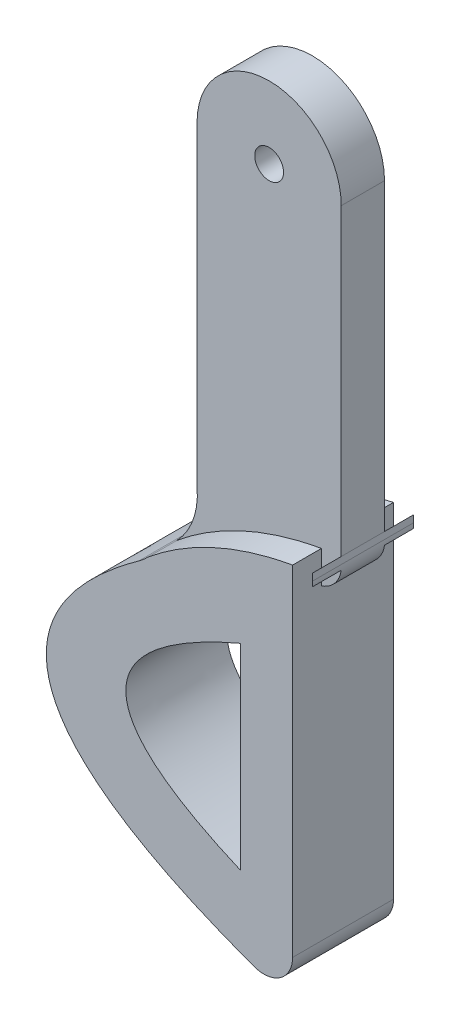
ISO-10303-21;
HEADER;
FILE_DESCRIPTION(('STEP AP214'),'2;1');
FILE_NAME('part.step','',(''),(''),'','','');
FILE_SCHEMA(('AUTOMOTIVE_DESIGN { 1 0 10303 214 1 1 1 1 }'));
ENDSEC;
DATA;
#1=APPLICATION_CONTEXT('core data for automotive mechanical design processes');
#2=APPLICATION_PROTOCOL_DEFINITION('international standard','automotive_design',2000,#1);
#3=PRODUCT_CONTEXT('',#1,'mechanical');
#4=PRODUCT('Part','Part','',(#3));
#5=PRODUCT_RELATED_PRODUCT_CATEGORY('part','',(#4));
#6=PRODUCT_DEFINITION_FORMATION('','',#4);
#7=PRODUCT_DEFINITION_CONTEXT('part definition',#1,'design');
#8=PRODUCT_DEFINITION('design','',#6,#7);
#9=PRODUCT_DEFINITION_SHAPE('','',#8);
#10=(LENGTH_UNIT() NAMED_UNIT(*) SI_UNIT(.MILLI.,.METRE.));
#11=(NAMED_UNIT(*) PLANE_ANGLE_UNIT() SI_UNIT($,.RADIAN.));
#12=(NAMED_UNIT(*) SI_UNIT($,.STERADIAN.) SOLID_ANGLE_UNIT());
#13=UNCERTAINTY_MEASURE_WITH_UNIT(LENGTH_MEASURE(1.E-05),#10,'distance_accuracy_value','');
#14=(GEOMETRIC_REPRESENTATION_CONTEXT(3) GLOBAL_UNCERTAINTY_ASSIGNED_CONTEXT((#13)) GLOBAL_UNIT_ASSIGNED_CONTEXT((#10,
#11,#12)) REPRESENTATION_CONTEXT('',''));
#15=CARTESIAN_POINT('',(0.,0.,0.));
#16=DIRECTION('',(0.,0.,1.));
#17=DIRECTION('',(1.,0.,0.));
#18=AXIS2_PLACEMENT_3D('',#15,#16,#17);
#19=CARTESIAN_POINT('',(-5.,0.,3.));
#20=DIRECTION('',(1.,0.,0.));
#21=DIRECTION('',(0.,0.,-1.));
#22=AXIS2_PLACEMENT_3D('',#19,#20,#21);
#23=PLANE('',#22);
#24=DIRECTION('',(0.,-1.,0.));
#25=VECTOR('',#24,1.);
#26=CARTESIAN_POINT('',(-5.,0.,0.));
#27=LINE('',#26,#25);
#28=CARTESIAN_POINT('',(-5.,0.,0.));
#29=VERTEX_POINT('',#28);
#30=CARTESIAN_POINT('',(-5.,-21.7449140027288,0.));
#31=VERTEX_POINT('',#30);
#32=EDGE_CURVE('E567',#29,#31,#27,.T.);
#33=ORIENTED_EDGE('',*,*,#32,.T.);
#34=DIRECTION('',(0.,0.,-1.));
#35=VECTOR('',#34,1.);
#36=CARTESIAN_POINT('',(-5.,-21.7449140027288,3.));
#37=LINE('',#36,#35);
#38=CARTESIAN_POINT('',(-5.,-21.7449140027288,3.));
#39=VERTEX_POINT('',#38);
#40=EDGE_CURVE('E345',#31,#39,#37,.F.);
#41=ORIENTED_EDGE('',*,*,#40,.T.);
#42=DIRECTION('',(0.,-1.,0.));
#43=VECTOR('',#42,1.);
#44=CARTESIAN_POINT('',(-5.,0.,3.));
#45=LINE('',#44,#43);
#46=CARTESIAN_POINT('',(-5.,0.,3.));
#47=VERTEX_POINT('',#46);
#48=EDGE_CURVE('E574',#47,#39,#45,.T.);
#49=ORIENTED_EDGE('',*,*,#48,.F.);
#50=DIRECTION('',(0.,0.,-1.));
#51=VECTOR('',#50,1.);
#52=CARTESIAN_POINT('',(-5.,0.,3.));
#53=LINE('',#52,#51);
#54=EDGE_CURVE('E555',#47,#29,#53,.T.);
#55=ORIENTED_EDGE('',*,*,#54,.T.);
#56=EDGE_LOOP('',(#33,#41,#49,#55));
#57=FACE_BOUND('',#56,.T.);
#58=ADVANCED_FACE('F39',(#57),#23,.F.);
#59=CARTESIAN_POINT('',(5.,-18.1113119604195,3.));
#60=DIRECTION('',(-1.,0.,0.));
#61=DIRECTION('',(0.,0.,1.));
#62=AXIS2_PLACEMENT_3D('',#59,#60,#61);
#63=PLANE('',#62);
#64=DIRECTION('',(0.,0.,-1.));
#65=VECTOR('',#64,1.);
#66=CARTESIAN_POINT('',(5.,-21.0685844003794,5.));
#67=LINE('',#66,#65);
#68=CARTESIAN_POINT('',(5.,-21.0685844003794,3.));
#69=VERTEX_POINT('',#68);
#70=CARTESIAN_POINT('',(5.,-21.0685844003794,0.));
#71=VERTEX_POINT('',#70);
#72=EDGE_CURVE('E410',#69,#71,#67,.T.);
#73=ORIENTED_EDGE('',*,*,#72,.T.);
#74=DIRECTION('',(0.,1.,0.));
#75=VECTOR('',#74,1.);
#76=CARTESIAN_POINT('',(5.,-18.1113119604195,0.));
#77=LINE('',#76,#75);
#78=CARTESIAN_POINT('',(5.,0.,0.));
#79=VERTEX_POINT('',#78);
#80=EDGE_CURVE('E564',#71,#79,#77,.T.);
#81=ORIENTED_EDGE('',*,*,#80,.T.);
#82=DIRECTION('',(0.,0.,-1.));
#83=VECTOR('',#82,1.);
#84=CARTESIAN_POINT('',(5.,0.,3.));
#85=LINE('',#84,#83);
#86=CARTESIAN_POINT('',(5.,0.,3.));
#87=VERTEX_POINT('',#86);
#88=EDGE_CURVE('E558',#87,#79,#85,.T.);
#89=ORIENTED_EDGE('',*,*,#88,.F.);
#90=DIRECTION('',(0.,1.,0.));
#91=VECTOR('',#90,1.);
#92=CARTESIAN_POINT('',(5.,-18.1113119604195,3.));
#93=LINE('',#92,#91);
#94=EDGE_CURVE('E563',#69,#87,#93,.T.);
#95=ORIENTED_EDGE('',*,*,#94,.F.);
#96=EDGE_LOOP('',(#73,#81,#89,#95));
#97=FACE_BOUND('',#96,.T.);
#98=ADVANCED_FACE('F308',(#97),#63,.F.);
#99=CARTESIAN_POINT('',(0.,0.,-2.));
#100=DIRECTION('',(0.,0.,1.));
#101=DIRECTION('',(1.,0.,0.));
#102=AXIS2_PLACEMENT_3D('',#99,#100,#101);
#103=PLANE('',#102);
#104=DIRECTION('',(0.,-1.,0.));
#105=VECTOR('',#104,1.);
#106=CARTESIAN_POINT('',(0.,0.,-2.));
#107=LINE('',#106,#105);
#108=CARTESIAN_POINT('',(0.,-27.7824292119615,-2.));
#109=VERTEX_POINT('',#108);
#110=CARTESIAN_POINT('',(0.,-41.4013766394128,-2.));
#111=VERTEX_POINT('',#110);
#112=EDGE_CURVE('E266',#109,#111,#107,.T.);
#113=ORIENTED_EDGE('',*,*,#112,.F.);
#114=CARTESIAN_POINT('',(0.,-41.4013766394128,-2.));
#115=CARTESIAN_POINT('',(-15.8731180361329,-34.5919029256872,-2.));
#116=CARTESIAN_POINT('',(0.,-27.7824292119615,-2.));
#117=B_SPLINE_CURVE_WITH_KNOTS('',2,(#114,#115,#116),.UNSPECIFIED.,.F.,.F.,(3,3),(0.,1.),.UNSPECIFIED.);
#118=EDGE_CURVE('E269',#111,#109,#117,.T.);
#119=ORIENTED_EDGE('',*,*,#118,.F.);
#120=EDGE_LOOP('',(#113,#119));
#121=FACE_BOUND('',#120,.T.);
#122=CARTESIAN_POINT('',(-9.97728763709814,-22.3083474319797,-2.));
#123=DIRECTION('',(0.,0.,1.));
#124=DIRECTION('',(1.,0.,0.));
#125=AXIS2_PLACEMENT_3D('',#122,#123,#124);
#126=CIRCLE('',#125,5.);
#127=CARTESIAN_POINT('',(-7.05337608426651,-26.3642987668971,-2.));
#128=VERTEX_POINT('',#127);
#129=CARTESIAN_POINT('',(-6.39993331971314,-25.8015602923544,-2.));
#130=VERTEX_POINT('',#129);
#131=EDGE_CURVE('E358',#128,#130,#126,.T.);
#132=ORIENTED_EDGE('',*,*,#131,.T.);
#133=CARTESIAN_POINT('',(3.62698575848767,-21.0043409745113,-2.));
#134=CARTESIAN_POINT('',(-2.57759639123351,-22.3609263451177,-2.));
#135=CARTESIAN_POINT('',(-7.05337608426651,-26.3642987668971,-2.));
#136=B_SPLINE_CURVE_WITH_KNOTS('',2,(#133,#134,#135),.UNSPECIFIED.,.F.,.F.,(3,3),(0.,1.),.UNSPECIFIED.);
#137=CARTESIAN_POINT('',(3.62698575848767,-21.0043409745113,-2.));
#138=VERTEX_POINT('',#137);
#139=EDGE_CURVE('E197',#138,#130,#136,.T.);
#140=ORIENTED_EDGE('',*,*,#139,.F.);
#141=DIRECTION('',(0.,-1.,0.));
#142=VECTOR('',#141,1.);
#143=CARTESIAN_POINT('',(3.62698575848767,0.,-2.));
#144=LINE('',#143,#142);
#145=CARTESIAN_POINT('',(3.62698575848767,-44.8321036066222,-2.));
#146=VERTEX_POINT('',#145);
#147=EDGE_CURVE('E186',#138,#146,#144,.T.);
#148=ORIENTED_EDGE('',*,*,#147,.T.);
#149=CARTESIAN_POINT('',(1.62698575848768,-44.8321036066222,-2.));
#150=DIRECTION('',(0.,0.,1.));
#151=DIRECTION('',(1.,0.,0.));
#152=AXIS2_PLACEMENT_3D('',#149,#150,#151);
#153=CIRCLE('',#152,2.);
#154=CARTESIAN_POINT('',(0.937190695118231,-46.709384291696,-2.));
#155=VERTEX_POINT('',#154);
#156=EDGE_CURVE('E348',#146,#155,#153,.F.);
#157=ORIENTED_EDGE('',*,*,#156,.T.);
#158=CARTESIAN_POINT('',(3.62698575848767,-47.6475896837959,-2.));
#159=CARTESIAN_POINT('',(-16.6826546340438,-40.9110727000526,-2.));
#160=CARTESIAN_POINT('',(-18.879741735812,-32.9434077781485,-2.));
#161=CARTESIAN_POINT('',(-2.96427554691078,-23.7445949181379,-2.));
#162=B_SPLINE_CURVE_WITH_KNOTS('',3,(#158,#159,#160,#161),.UNSPECIFIED.,.F.,.F.,(4,4),(0.,
0.912623114466997),.UNSPECIFIED.);
#163=EDGE_CURVE('E254',#155,#128,#162,.T.);
#164=ORIENTED_EDGE('',*,*,#163,.T.);
#165=EDGE_LOOP('',(#132,#140,#148,#157,#164));
#166=FACE_BOUND('',#165,.T.);
#167=ADVANCED_FACE('F311',(#121,#166),#103,.F.);
#168=CARTESIAN_POINT('',(-3.,-21.7449140027288,1.5));
#169=DIRECTION('',(0.,0.,-1.));
#170=DIRECTION('',(-1.,0.,0.));
#171=AXIS2_PLACEMENT_3D('',#168,#169,#170);
#172=CYLINDRICAL_SURFACE('',#171,2.);
#173=ORIENTED_EDGE('',*,*,#40,.F.);
#174=CARTESIAN_POINT('',(-3.,-21.7449140027288,0.));
#175=DIRECTION('',(0.,0.,-1.));
#176=DIRECTION('',(-1.,0.,0.));
#177=AXIS2_PLACEMENT_3D('',#174,#175,#176);
#178=CIRCLE('',#177,2.);
#179=CARTESIAN_POINT('',(-4.99351075345661,-21.9058949825148,0.));
#180=VERTEX_POINT('',#179);
#181=EDGE_CURVE('E189',#31,#180,#178,.F.);
#182=ORIENTED_EDGE('',*,*,#181,.T.);
#183=DIRECTION('',(0.,0.,-1.));
#184=VECTOR('',#183,1.);
#185=CARTESIAN_POINT('',(-4.99351075345661,-21.9058949825148,1.5));
#186=LINE('',#185,#184);
#187=CARTESIAN_POINT('',(-4.99351075345661,-21.9058949825148,3.));
#188=VERTEX_POINT('',#187);
#189=EDGE_CURVE('E62',#180,#188,#186,.F.);
#190=ORIENTED_EDGE('',*,*,#189,.T.);
#191=CARTESIAN_POINT('',(-3.,-21.7449140027288,3.));
#192=DIRECTION('',(0.,0.,-1.));
#193=DIRECTION('',(-1.,0.,0.));
#194=AXIS2_PLACEMENT_3D('',#191,#192,#193);
#195=CIRCLE('',#194,2.);
#196=EDGE_CURVE('E250',#39,#188,#195,.F.);
#197=ORIENTED_EDGE('',*,*,#196,.F.);
#198=EDGE_LOOP('',(#173,#182,#190,#197));
#199=FACE_BOUND('',#198,.T.);
#200=ADVANCED_FACE('F324',(#199),#172,.T.);
#201=CARTESIAN_POINT('',(0.,0.,5.));
#202=DIRECTION('',(0.,0.,1.));
#203=DIRECTION('',(1.,0.,0.));
#204=AXIS2_PLACEMENT_3D('',#201,#202,#203);
#205=PLANE('',#204);
#206=DIRECTION('',(0.,1.,0.));
#207=VECTOR('',#206,1.);
#208=CARTESIAN_POINT('',(5.,-18.1113119604195,5.));
#209=LINE('',#208,#207);
#210=CARTESIAN_POINT('',(5.,-21.8922590889572,5.));
#211=VERTEX_POINT('',#210);
#212=CARTESIAN_POINT('',(5.,-21.0685844003794,5.));
#213=VERTEX_POINT('',#212);
#214=EDGE_CURVE('E228',#211,#213,#209,.T.);
#215=ORIENTED_EDGE('',*,*,#214,.F.);
#216=CARTESIAN_POINT('',(3.01986534624494,-21.6110709793253,5.));
#217=DIRECTION('',(0.,0.,1.));
#218=DIRECTION('',(1.,0.,0.));
#219=AXIS2_PLACEMENT_3D('',#216,#217,#218);
#220=CIRCLE('',#219,2.);
#221=CARTESIAN_POINT('',(5.01830746908498,-21.5321464479133,5.));
#222=VERTEX_POINT('',#221);
#223=EDGE_CURVE('E342',#211,#222,#220,.T.);
#224=ORIENTED_EDGE('',*,*,#223,.T.);
#225=DIRECTION('',(0.0394622657060186,-0.999221061420018,0.));
#226=VECTOR('',#225,1.);
#227=CARTESIAN_POINT('',(4.16144719276876,0.164348151958715,5.));
#228=LINE('',#227,#226);
#229=EDGE_CURVE('E398',#213,#222,#228,.T.);
#230=ORIENTED_EDGE('',*,*,#229,.F.);
#231=EDGE_LOOP('',(#215,#224,#230));
#232=FACE_BOUND('',#231,.T.);
#233=ADVANCED_FACE('F304',(#232),#205,.T.);
#234=CARTESIAN_POINT('',(0.,0.,3.));
#235=DIRECTION('',(0.,0.,1.));
#236=DIRECTION('',(1.,0.,0.));
#237=AXIS2_PLACEMENT_3D('',#234,#235,#236);
#238=PLANE('',#237);
#239=CARTESIAN_POINT('',(0.,0.,3.));
#240=DIRECTION('',(0.,0.,1.));
#241=DIRECTION('',(1.,0.,0.));
#242=AXIS2_PLACEMENT_3D('',#239,#240,#241);
#243=CIRCLE('',#242,5.);
#244=EDGE_CURVE('E566',#87,#47,#243,.T.);
#245=ORIENTED_EDGE('',*,*,#244,.T.);
#246=ORIENTED_EDGE('',*,*,#48,.T.);
#247=ORIENTED_EDGE('',*,*,#196,.T.);
#248=CARTESIAN_POINT('',(-9.97728763709814,-22.3083474319797,3.));
#249=DIRECTION('',(0.,0.,-1.));
#250=DIRECTION('',(-1.,0.,0.));
#251=AXIS2_PLACEMENT_3D('',#248,#249,#250);
#252=CIRCLE('',#251,5.);
#253=CARTESIAN_POINT('',(-6.39993331971315,-25.8015602923544,3.));
#254=VERTEX_POINT('',#253);
#255=EDGE_CURVE('E363',#254,#188,#252,.F.);
#256=ORIENTED_EDGE('',*,*,#255,.F.);
#257=CARTESIAN_POINT('',(-7.05337608426651,-26.3642987668971,3.));
#258=CARTESIAN_POINT('',(-2.62387187451652,-22.3888880242397,3.));
#259=CARTESIAN_POINT('',(3.62698575848767,-21.2692084881121,3.));
#260=B_SPLINE_CURVE_WITH_KNOTS('',2,(#257,#258,#259),.UNSPECIFIED.,.F.,.F.,(3,3),(0.,1.),.UNSPECIFIED.);
#261=CARTESIAN_POINT('',(3.62698575848767,-21.2692084881121,3.));
#262=VERTEX_POINT('',#261);
#263=EDGE_CURVE('E221',#254,#262,#260,.T.);
#264=ORIENTED_EDGE('',*,*,#263,.T.);
#265=DIRECTION('',(0.,-1.,0.));
#266=VECTOR('',#265,1.);
#267=CARTESIAN_POINT('',(3.62698575848767,-21.2692084881121,3.));
#268=LINE('',#267,#266);
#269=CARTESIAN_POINT('',(3.62698575848767,-23.516695497702,3.));
#270=VERTEX_POINT('',#269);
#271=EDGE_CURVE('E227',#262,#270,#268,.T.);
#272=ORIENTED_EDGE('',*,*,#271,.T.);
#273=CARTESIAN_POINT('',(3.01986534624494,-21.6110709793253,3.));
#274=DIRECTION('',(0.,0.,-1.));
#275=DIRECTION('',(-1.,0.,0.));
#276=AXIS2_PLACEMENT_3D('',#273,#274,#275);
#277=CIRCLE('',#276,2.);
#278=CARTESIAN_POINT('',(5.,-21.8922590889572,3.));
#279=VERTEX_POINT('',#278);
#280=EDGE_CURVE('E252',#270,#279,#277,.F.);
#281=ORIENTED_EDGE('',*,*,#280,.T.);
#282=DIRECTION('',(0.,1.,0.));
#283=VECTOR('',#282,1.);
#284=CARTESIAN_POINT('',(5.,-18.1113119604195,3.));
#285=LINE('',#284,#283);
#286=EDGE_CURVE('E235',#279,#69,#285,.T.);
#287=ORIENTED_EDGE('',*,*,#286,.T.);
#288=ORIENTED_EDGE('',*,*,#94,.T.);
#289=EDGE_LOOP('',(#245,#246,#247,#256,#264,#272,#281,#287,#288));
#290=FACE_BOUND('',#289,.T.);
#291=CARTESIAN_POINT('',(0.,0.,3.));
#292=DIRECTION('',(0.,0.,1.));
#293=DIRECTION('',(1.,0.,0.));
#294=AXIS2_PLACEMENT_3D('',#291,#292,#293);
#295=CIRCLE('',#294,1.);
#296=CARTESIAN_POINT('',(1.,0.,3.));
#297=VERTEX_POINT('',#296);
#298=EDGE_CURVE('E572',#297,#297,#295,.T.);
#299=ORIENTED_EDGE('',*,*,#298,.F.);
#300=EDGE_LOOP('',(#299));
#301=FACE_BOUND('',#300,.T.);
#302=ADVANCED_FACE('F301',(#290,#301),#238,.T.);
#303=CARTESIAN_POINT('',(0.,0.,0.));
#304=DIRECTION('',(0.,0.,1.));
#305=DIRECTION('',(1.,0.,0.));
#306=AXIS2_PLACEMENT_3D('',#303,#304,#305);
#307=PLANE('',#306);
#308=CARTESIAN_POINT('',(0.,0.,0.));
#309=DIRECTION('',(0.,0.,1.));
#310=DIRECTION('',(1.,0.,0.));
#311=AXIS2_PLACEMENT_3D('',#308,#309,#310);
#312=CIRCLE('',#311,5.);
#313=EDGE_CURVE('E569',#79,#29,#312,.T.);
#314=ORIENTED_EDGE('',*,*,#313,.F.);
#315=ORIENTED_EDGE('',*,*,#80,.F.);
#316=DIRECTION('',(0.,-1.,0.));
#317=VECTOR('',#316,1.);
#318=CARTESIAN_POINT('',(5.,-18.1113119604195,0.));
#319=LINE('',#318,#317);
#320=CARTESIAN_POINT('',(5.,-21.8922590889572,0.));
#321=VERTEX_POINT('',#320);
#322=EDGE_CURVE('E181',#71,#321,#319,.T.);
#323=ORIENTED_EDGE('',*,*,#322,.T.);
#324=CARTESIAN_POINT('',(3.01986534624494,-21.6110709793253,0.));
#325=DIRECTION('',(0.,0.,-1.));
#326=DIRECTION('',(-1.,0.,0.));
#327=AXIS2_PLACEMENT_3D('',#324,#325,#326);
#328=CIRCLE('',#327,2.);
#329=CARTESIAN_POINT('',(3.62698575848767,-23.516695497702,0.));
#330=VERTEX_POINT('',#329);
#331=EDGE_CURVE('E176',#330,#321,#328,.F.);
#332=ORIENTED_EDGE('',*,*,#331,.F.);
#333=DIRECTION('',(0.,1.,0.));
#334=VECTOR('',#333,1.);
#335=CARTESIAN_POINT('',(3.62698575848767,-21.0043409745113,0.));
#336=LINE('',#335,#334);
#337=CARTESIAN_POINT('',(3.62698575848767,-21.0043409745113,0.));
#338=VERTEX_POINT('',#337);
#339=EDGE_CURVE('E169',#330,#338,#336,.T.);
#340=ORIENTED_EDGE('',*,*,#339,.T.);
#341=CARTESIAN_POINT('',(3.62698575848767,-21.0043409745113,0.));
#342=CARTESIAN_POINT('',(-2.57759639123351,-22.3609263451177,0.));
#343=CARTESIAN_POINT('',(-7.05337608426651,-26.3642987668971,0.));
#344=B_SPLINE_CURVE_WITH_KNOTS('',2,(#341,#342,#343),.UNSPECIFIED.,.F.,.F.,(3,3),(0.,1.),.UNSPECIFIED.);
#345=CARTESIAN_POINT('',(-6.39993331971314,-25.8015602923544,0.));
#346=VERTEX_POINT('',#345);
#347=EDGE_CURVE('E54',#338,#346,#344,.T.);
#348=ORIENTED_EDGE('',*,*,#347,.T.);
#349=CARTESIAN_POINT('',(-9.97728763709814,-22.3083474319797,0.));
#350=DIRECTION('',(0.,0.,-1.));
#351=DIRECTION('',(-1.,0.,0.));
#352=AXIS2_PLACEMENT_3D('',#349,#350,#351);
#353=CIRCLE('',#352,5.);
#354=EDGE_CURVE('E371',#346,#180,#353,.F.);
#355=ORIENTED_EDGE('',*,*,#354,.T.);
#356=ORIENTED_EDGE('',*,*,#181,.F.);
#357=ORIENTED_EDGE('',*,*,#32,.F.);
#358=EDGE_LOOP('',(#314,#315,#323,#332,#340,#348,#355,#356,#357));
#359=FACE_BOUND('',#358,.T.);
#360=CARTESIAN_POINT('',(0.,0.,0.));
#361=DIRECTION('',(0.,0.,1.));
#362=DIRECTION('',(1.,0.,0.));
#363=AXIS2_PLACEMENT_3D('',#360,#361,#362);
#364=CIRCLE('',#363,1.);
#365=CARTESIAN_POINT('',(1.,0.,0.));
#366=VERTEX_POINT('',#365);
#367=EDGE_CURVE('E578',#366,#366,#364,.T.);
#368=ORIENTED_EDGE('',*,*,#367,.T.);
#369=EDGE_LOOP('',(#368));
#370=FACE_BOUND('',#369,.T.);
#371=ADVANCED_FACE('F172',(#359,#370),#307,.F.);
#372=CARTESIAN_POINT('',(0.,0.,3.));
#373=DIRECTION('',(0.,0.,-1.));
#374=DIRECTION('',(-1.,0.,0.));
#375=AXIS2_PLACEMENT_3D('',#372,#373,#374);
#376=CYLINDRICAL_SURFACE('',#375,5.);
#377=ORIENTED_EDGE('',*,*,#313,.T.);
#378=ORIENTED_EDGE('',*,*,#54,.F.);
#379=ORIENTED_EDGE('',*,*,#244,.F.);
#380=ORIENTED_EDGE('',*,*,#88,.T.);
#381=EDGE_LOOP('',(#377,#378,#379,#380));
#382=FACE_BOUND('',#381,.T.);
#383=ADVANCED_FACE('F299',(#382),#376,.T.);
#384=CARTESIAN_POINT('',(0.,0.,3.));
#385=DIRECTION('',(0.,0.,-1.));
#386=DIRECTION('',(-1.,0.,0.));
#387=AXIS2_PLACEMENT_3D('',#384,#385,#386);
#388=CYLINDRICAL_SURFACE('',#387,1.);
#389=ORIENTED_EDGE('',*,*,#298,.T.);
#390=EDGE_LOOP('',(#389));
#391=FACE_BOUND('',#390,.T.);
#392=ORIENTED_EDGE('',*,*,#367,.F.);
#393=EDGE_LOOP('',(#392));
#394=FACE_BOUND('',#393,.T.);
#395=ADVANCED_FACE('F296',(#391,#394),#388,.F.);
#396=CARTESIAN_POINT('',(0.,0.,5.));
#397=DIRECTION('',(1.,0.,0.));
#398=DIRECTION('',(0.,0.,-1.));
#399=AXIS2_PLACEMENT_3D('',#396,#397,#398);
#400=PLANE('',#399);
#401=DIRECTION('',(0.,0.,-1.));
#402=VECTOR('',#401,1.);
#403=CARTESIAN_POINT('',(0.,-27.7824292119615,5.));
#404=LINE('',#403,#402);
#405=CARTESIAN_POINT('',(0.,-27.7824292119615,5.));
#406=VERTEX_POINT('',#405);
#407=EDGE_CURVE('E411',#406,#109,#404,.T.);
#408=ORIENTED_EDGE('',*,*,#407,.T.);
#409=ORIENTED_EDGE('',*,*,#112,.T.);
#410=DIRECTION('',(0.,0.,-1.));
#411=VECTOR('',#410,1.);
#412=CARTESIAN_POINT('',(0.,-41.4013766394128,5.));
#413=LINE('',#412,#411);
#414=CARTESIAN_POINT('',(0.,-41.4013766394128,5.));
#415=VERTEX_POINT('',#414);
#416=EDGE_CURVE('E581',#415,#111,#413,.T.);
#417=ORIENTED_EDGE('',*,*,#416,.F.);
#418=DIRECTION('',(0.,-1.,0.));
#419=VECTOR('',#418,1.);
#420=CARTESIAN_POINT('',(0.,0.,5.));
#421=LINE('',#420,#419);
#422=EDGE_CURVE('E401',#406,#415,#421,.T.);
#423=ORIENTED_EDGE('',*,*,#422,.F.);
#424=EDGE_LOOP('',(#408,#409,#417,#423));
#425=FACE_BOUND('',#424,.T.);
#426=ADVANCED_FACE('F293',(#425),#400,.F.);
#427=CARTESIAN_POINT('',(3.62698575848767,-47.6475896837959,5.));
#428=CARTESIAN_POINT('',(-16.6826546340438,-40.9110727000526,5.));
#429=CARTESIAN_POINT('',(-18.879741735812,-32.9434077781485,5.));
#430=CARTESIAN_POINT('',(-2.96427554691078,-23.7445949181379,5.));
#431=B_SPLINE_CURVE_WITH_KNOTS('',3,(#427,#428,#429,#430),.UNSPECIFIED.,.F.,.F.,(4,4),(0.,
0.912623114466997),.UNSPECIFIED.);
#432=DIRECTION('',(0.,0.,-1.));
#433=VECTOR('',#432,1.);
#434=SURFACE_OF_LINEAR_EXTRUSION('',#431,#433);
#435=CARTESIAN_POINT('',(0.937190695118231,-46.709384291696,5.));
#436=VERTEX_POINT('',#435);
#437=CARTESIAN_POINT('',(-7.05337608426651,-26.3642987668971,5.));
#438=VERTEX_POINT('',#437);
#439=EDGE_CURVE('E274',#436,#438,#431,.T.);
#440=ORIENTED_EDGE('',*,*,#439,.T.);
#441=DIRECTION('',(0.,0.,-1.));
#442=VECTOR('',#441,1.);
#443=CARTESIAN_POINT('',(-7.05337608426651,-26.3642987668971,5.));
#444=LINE('',#443,#442);
#445=EDGE_CURVE('E355',#438,#128,#444,.T.);
#446=ORIENTED_EDGE('',*,*,#445,.T.);
#447=ORIENTED_EDGE('',*,*,#163,.F.);
#448=DIRECTION('',(0.,0.,-1.));
#449=VECTOR('',#448,1.);
#450=CARTESIAN_POINT('',(0.937190695118229,-46.709384291696,-2.));
#451=LINE('',#450,#449);
#452=EDGE_CURVE('E338',#155,#436,#451,.F.);
#453=ORIENTED_EDGE('',*,*,#452,.T.);
#454=EDGE_LOOP('',(#440,#446,#447,#453));
#455=FACE_BOUND('',#454,.T.);
#456=ADVANCED_FACE('F289',(#455),#434,.T.);
#457=CARTESIAN_POINT('',(3.62698575848767,0.,5.));
#458=DIRECTION('',(1.,0.,0.));
#459=DIRECTION('',(0.,1.,0.));
#460=AXIS2_PLACEMENT_3D('',#457,#458,#459);
#461=PLANE('',#460);
#462=DIRECTION('',(0.,0.,-1.));
#463=VECTOR('',#462,1.);
#464=CARTESIAN_POINT('',(3.62698575848767,-44.8321036066222,5.));
#465=LINE('',#464,#463);
#466=CARTESIAN_POINT('',(3.62698575848767,-44.8321036066222,5.));
#467=VERTEX_POINT('',#466);
#468=EDGE_CURVE('E339',#467,#146,#465,.T.);
#469=ORIENTED_EDGE('',*,*,#468,.T.);
#470=ORIENTED_EDGE('',*,*,#147,.F.);
#471=DIRECTION('',(0.,0.,-1.));
#472=VECTOR('',#471,1.);
#473=CARTESIAN_POINT('',(3.62698575848767,-21.0043409745113,0.));
#474=LINE('',#473,#472);
#475=EDGE_CURVE('E180',#338,#138,#474,.T.);
#476=ORIENTED_EDGE('',*,*,#475,.F.);
#477=ORIENTED_EDGE('',*,*,#339,.F.);
#478=DIRECTION('',(0.,0.,-1.));
#479=VECTOR('',#478,1.);
#480=CARTESIAN_POINT('',(3.62698575848767,-23.516695497702,5.));
#481=LINE('',#480,#479);
#482=EDGE_CURVE('E383',#270,#330,#481,.T.);
#483=ORIENTED_EDGE('',*,*,#482,.F.);
#484=ORIENTED_EDGE('',*,*,#271,.F.);
#485=DIRECTION('',(0.,0.,1.));
#486=VECTOR('',#485,1.);
#487=CARTESIAN_POINT('',(3.62698575848767,-21.2692084881121,3.));
#488=LINE('',#487,#486);
#489=CARTESIAN_POINT('',(3.62698575848767,-21.2692084881121,5.));
#490=VERTEX_POINT('',#489);
#491=EDGE_CURVE('E238',#262,#490,#488,.T.);
#492=ORIENTED_EDGE('',*,*,#491,.T.);
#493=DIRECTION('',(0.,-1.,0.));
#494=VECTOR('',#493,1.);
#495=CARTESIAN_POINT('',(3.62698575848767,0.,5.));
#496=LINE('',#495,#494);
#497=EDGE_CURVE('E283',#490,#467,#496,.T.);
#498=ORIENTED_EDGE('',*,*,#497,.T.);
#499=EDGE_LOOP('',(#469,#470,#476,#477,#483,#484,#492,#498));
#500=FACE_BOUND('',#499,.T.);
#501=ADVANCED_FACE('F185',(#500),#461,.T.);
#502=CARTESIAN_POINT('',(4.16144719276876,0.164348151958715,5.));
#503=DIRECTION('',(0.999221061420018,0.0394622657060186,0.));
#504=DIRECTION('',(-0.0394622657060186,0.999221061420018,0.));
#505=AXIS2_PLACEMENT_3D('',#502,#503,#504);
#506=PLANE('',#505);
#507=ORIENTED_EDGE('',*,*,#229,.T.);
#508=DIRECTION('',(0.,0.,1.));
#509=VECTOR('',#508,1.);
#510=CARTESIAN_POINT('',(5.01830746908498,-21.5321464479133,-2.));
#511=LINE('',#510,#509);
#512=CARTESIAN_POINT('',(5.01830746908498,-21.5321464479133,-2.));
#513=VERTEX_POINT('',#512);
#514=EDGE_CURVE('E554',#222,#513,#511,.F.);
#515=ORIENTED_EDGE('',*,*,#514,.T.);
#516=DIRECTION('',(0.0394622657060186,-0.999221061420018,0.));
#517=VECTOR('',#516,1.);
#518=CARTESIAN_POINT('',(4.16144719276876,0.164348151958715,-2.));
#519=LINE('',#518,#517);
#520=CARTESIAN_POINT('',(5.,-21.0685844003794,-2.));
#521=VERTEX_POINT('',#520);
#522=EDGE_CURVE('E263',#521,#513,#519,.T.);
#523=ORIENTED_EDGE('',*,*,#522,.F.);
#524=DIRECTION('',(0.,0.,-1.));
#525=VECTOR('',#524,1.);
#526=CARTESIAN_POINT('',(5.,-21.0685844003794,5.));
#527=LINE('',#526,#525);
#528=EDGE_CURVE('E229',#71,#521,#527,.T.);
#529=ORIENTED_EDGE('',*,*,#528,.F.);
#530=ORIENTED_EDGE('',*,*,#72,.F.);
#531=EDGE_CURVE('E585',#213,#69,#67,.T.);
#532=ORIENTED_EDGE('',*,*,#531,.F.);
#533=EDGE_LOOP('',(#507,#515,#523,#529,#530,#532));
#534=FACE_BOUND('',#533,.T.);
#535=ADVANCED_FACE('F420',(#534),#506,.T.);
#536=CARTESIAN_POINT('',(0.,-41.4013766394128,5.));
#537=CARTESIAN_POINT('',(-15.8731180361329,-34.5919029256872,5.));
#538=CARTESIAN_POINT('',(0.,-27.7824292119615,5.));
#539=B_SPLINE_CURVE_WITH_KNOTS('',2,(#536,#537,#538),.UNSPECIFIED.,.F.,.F.,(3,3),(0.,1.),.UNSPECIFIED.);
#540=DIRECTION('',(0.,0.,-1.));
#541=VECTOR('',#540,1.);
#542=SURFACE_OF_LINEAR_EXTRUSION('',#539,#541);
#543=ORIENTED_EDGE('',*,*,#416,.T.);
#544=ORIENTED_EDGE('',*,*,#118,.T.);
#545=ORIENTED_EDGE('',*,*,#407,.F.);
#546=EDGE_CURVE('E403',#415,#406,#539,.T.);
#547=ORIENTED_EDGE('',*,*,#546,.F.);
#548=EDGE_LOOP('',(#543,#544,#545,#547));
#549=FACE_BOUND('',#548,.T.);
#550=ADVANCED_FACE('F417',(#549),#542,.F.);
#551=CARTESIAN_POINT('',(-7.05337608426651,-26.3642987668971,5.));
#552=CARTESIAN_POINT('',(-2.62387187451652,-22.3888880242397,5.));
#553=CARTESIAN_POINT('',(3.62698575848767,-21.2692084881121,5.));
#554=B_SPLINE_CURVE_WITH_KNOTS('',2,(#551,#552,#553),.UNSPECIFIED.,.F.,.F.,(3,3),(0.,1.),.UNSPECIFIED.);
#555=CARTESIAN_POINT('',(-6.39993331971315,-25.8015602923544,5.));
#556=VERTEX_POINT('',#555);
#557=EDGE_CURVE('E239',#556,#490,#554,.T.);
#558=ORIENTED_EDGE('',*,*,#557,.F.);
#559=CARTESIAN_POINT('',(-9.97728763709814,-22.3083474319797,5.));
#560=DIRECTION('',(0.,0.,1.));
#561=DIRECTION('',(1.,0.,0.));
#562=AXIS2_PLACEMENT_3D('',#559,#560,#561);
#563=CIRCLE('',#562,5.);
#564=EDGE_CURVE('E361',#556,#438,#563,.F.);
#565=ORIENTED_EDGE('',*,*,#564,.T.);
#566=ORIENTED_EDGE('',*,*,#439,.F.);
#567=CARTESIAN_POINT('',(1.62698575848768,-44.8321036066222,5.));
#568=DIRECTION('',(0.,0.,1.));
#569=DIRECTION('',(1.,0.,0.));
#570=AXIS2_PLACEMENT_3D('',#567,#568,#569);
#571=CIRCLE('',#570,2.);
#572=EDGE_CURVE('E336',#436,#467,#571,.T.);
#573=ORIENTED_EDGE('',*,*,#572,.T.);
#574=ORIENTED_EDGE('',*,*,#497,.F.);
#575=EDGE_LOOP('',(#558,#565,#566,#573,#574));
#576=FACE_BOUND('',#575,.T.);
#577=ORIENTED_EDGE('',*,*,#422,.T.);
#578=ORIENTED_EDGE('',*,*,#546,.T.);
#579=EDGE_LOOP('',(#577,#578));
#580=FACE_BOUND('',#579,.T.);
#581=ADVANCED_FACE('F378',(#576,#580),#205,.T.);
#582=CARTESIAN_POINT('',(3.01986534624494,-21.6110709793253,-2.));
#583=DIRECTION('',(0.,0.,1.));
#584=DIRECTION('',(1.,0.,0.));
#585=AXIS2_PLACEMENT_3D('',#582,#583,#584);
#586=CIRCLE('',#585,2.);
#587=CARTESIAN_POINT('',(5.,-21.8922590889572,-2.));
#588=VERTEX_POINT('',#587);
#589=EDGE_CURVE('E343',#513,#588,#586,.F.);
#590=ORIENTED_EDGE('',*,*,#589,.T.);
#591=DIRECTION('',(0.,-1.,0.));
#592=VECTOR('',#591,1.);
#593=CARTESIAN_POINT('',(5.,-18.1113119604195,-2.));
#594=LINE('',#593,#592);
#595=EDGE_CURVE('E194',#521,#588,#594,.T.);
#596=ORIENTED_EDGE('',*,*,#595,.F.);
#597=ORIENTED_EDGE('',*,*,#522,.T.);
#598=EDGE_LOOP('',(#590,#596,#597));
#599=FACE_BOUND('',#598,.T.);
#600=ADVANCED_FACE('F219',(#599),#103,.F.);
#601=CARTESIAN_POINT('',(3.01986534624494,-21.6110709793253,5.));
#602=DIRECTION('',(0.,0.,-1.));
#603=DIRECTION('',(-1.,0.,0.));
#604=AXIS2_PLACEMENT_3D('',#601,#602,#603);
#605=CYLINDRICAL_SURFACE('',#604,2.);
#606=DIRECTION('',(0.,0.,-1.));
#607=VECTOR('',#606,1.);
#608=CARTESIAN_POINT('',(5.,-21.8922590889572,5.));
#609=LINE('',#608,#607);
#610=EDGE_CURVE('E11',#588,#321,#609,.F.);
#611=ORIENTED_EDGE('',*,*,#610,.F.);
#612=ORIENTED_EDGE('',*,*,#589,.F.);
#613=ORIENTED_EDGE('',*,*,#514,.F.);
#614=ORIENTED_EDGE('',*,*,#223,.F.);
#615=DIRECTION('',(0.,0.,-1.));
#616=VECTOR('',#615,1.);
#617=CARTESIAN_POINT('',(5.,-21.8922590889572,5.));
#618=LINE('',#617,#616);
#619=EDGE_CURVE('E369',#279,#211,#618,.F.);
#620=ORIENTED_EDGE('',*,*,#619,.F.);
#621=ORIENTED_EDGE('',*,*,#280,.F.);
#622=ORIENTED_EDGE('',*,*,#482,.T.);
#623=ORIENTED_EDGE('',*,*,#331,.T.);
#624=EDGE_LOOP('',(#611,#612,#613,#614,#620,#621,#622,#623));
#625=FACE_BOUND('',#624,.T.);
#626=ADVANCED_FACE('F319',(#625),#605,.T.);
#627=CARTESIAN_POINT('',(1.62698575848768,-44.8321036066222,1.5));
#628=DIRECTION('',(0.,0.,-1.));
#629=DIRECTION('',(-1.,0.,0.));
#630=AXIS2_PLACEMENT_3D('',#627,#628,#629);
#631=CYLINDRICAL_SURFACE('',#630,2.);
#632=ORIENTED_EDGE('',*,*,#572,.F.);
#633=ORIENTED_EDGE('',*,*,#452,.F.);
#634=ORIENTED_EDGE('',*,*,#156,.F.);
#635=ORIENTED_EDGE('',*,*,#468,.F.);
#636=EDGE_LOOP('',(#632,#633,#634,#635));
#637=FACE_BOUND('',#636,.T.);
#638=ADVANCED_FACE('F322',(#637),#631,.T.);
#639=CARTESIAN_POINT('',(-9.97728763709814,-22.3083474319797,1.5));
#640=DIRECTION('',(0.,0.,-1.));
#641=DIRECTION('',(-1.,0.,0.));
#642=AXIS2_PLACEMENT_3D('',#639,#640,#641);
#643=CYLINDRICAL_SURFACE('',#642,5.);
#644=ORIENTED_EDGE('',*,*,#354,.F.);
#645=DIRECTION('',(0.,0.,-1.));
#646=VECTOR('',#645,1.);
#647=CARTESIAN_POINT('',(-6.39993331971314,-25.8015602923544,0.));
#648=LINE('',#647,#646);
#649=EDGE_CURVE('E47',#346,#130,#648,.T.);
#650=ORIENTED_EDGE('',*,*,#649,.T.);
#651=ORIENTED_EDGE('',*,*,#131,.F.);
#652=ORIENTED_EDGE('',*,*,#445,.F.);
#653=ORIENTED_EDGE('',*,*,#564,.F.);
#654=DIRECTION('',(0.,0.,1.));
#655=VECTOR('',#654,1.);
#656=CARTESIAN_POINT('',(-6.39993331971315,-25.8015602923544,3.));
#657=LINE('',#656,#655);
#658=EDGE_CURVE('E366',#556,#254,#657,.F.);
#659=ORIENTED_EDGE('',*,*,#658,.T.);
#660=ORIENTED_EDGE('',*,*,#255,.T.);
#661=ORIENTED_EDGE('',*,*,#189,.F.);
#662=EDGE_LOOP('',(#644,#650,#651,#652,#653,#659,#660,#661));
#663=FACE_BOUND('',#662,.T.);
#664=ADVANCED_FACE('F41',(#663),#643,.F.);
#665=DIRECTION('',(0.,0.,1.));
#666=VECTOR('',#665,1.);
#667=SURFACE_OF_LINEAR_EXTRUSION('',#260,#666);
#668=ORIENTED_EDGE('',*,*,#557,.T.);
#669=ORIENTED_EDGE('',*,*,#491,.F.);
#670=ORIENTED_EDGE('',*,*,#263,.F.);
#671=ORIENTED_EDGE('',*,*,#658,.F.);
#672=EDGE_LOOP('',(#668,#669,#670,#671));
#673=FACE_BOUND('',#672,.T.);
#674=ADVANCED_FACE('F213',(#673),#667,.F.);
#675=CARTESIAN_POINT('',(5.,-18.1113119604195,3.));
#676=DIRECTION('',(1.,0.,0.));
#677=DIRECTION('',(0.,0.,-1.));
#678=AXIS2_PLACEMENT_3D('',#675,#676,#677);
#679=PLANE('',#678);
#680=ORIENTED_EDGE('',*,*,#531,.T.);
#681=ORIENTED_EDGE('',*,*,#286,.F.);
#682=ORIENTED_EDGE('',*,*,#619,.T.);
#683=ORIENTED_EDGE('',*,*,#214,.T.);
#684=EDGE_LOOP('',(#680,#681,#682,#683));
#685=FACE_BOUND('',#684,.T.);
#686=ADVANCED_FACE('F210',(#685),#679,.F.);
#687=DIRECTION('',(0.,0.,-1.));
#688=VECTOR('',#687,1.);
#689=SURFACE_OF_LINEAR_EXTRUSION('',#344,#688);
#690=ORIENTED_EDGE('',*,*,#347,.F.);
#691=ORIENTED_EDGE('',*,*,#475,.T.);
#692=ORIENTED_EDGE('',*,*,#139,.T.);
#693=ORIENTED_EDGE('',*,*,#649,.F.);
#694=EDGE_LOOP('',(#690,#691,#692,#693));
#695=FACE_BOUND('',#694,.T.);
#696=ADVANCED_FACE('F191',(#695),#689,.F.);
#697=CARTESIAN_POINT('',(5.,-18.1113119604195,0.));
#698=DIRECTION('',(1.,0.,0.));
#699=DIRECTION('',(0.,0.,-1.));
#700=AXIS2_PLACEMENT_3D('',#697,#698,#699);
#701=PLANE('',#700);
#702=ORIENTED_EDGE('',*,*,#528,.T.);
#703=ORIENTED_EDGE('',*,*,#595,.T.);
#704=ORIENTED_EDGE('',*,*,#610,.T.);
#705=ORIENTED_EDGE('',*,*,#322,.F.);
#706=EDGE_LOOP('',(#702,#703,#704,#705));
#707=FACE_BOUND('',#706,.T.);
#708=ADVANCED_FACE('F209',(#707),#701,.F.);
#709=CLOSED_SHELL('',(#58,#98,#167,#200,#233,#302,#371,#383,#395,#426,#456,#501,#535,#550,#581,
#600,#626,#638,#664,#674,#686,#696,#708));
#710=MANIFOLD_SOLID_BREP('B2',#709);
#711=ADVANCED_BREP_SHAPE_REPRESENTATION('',(#18,#710),#14);
#712=SHAPE_DEFINITION_REPRESENTATION(#9,#711);
ENDSEC;
END-ISO-10303-21;
